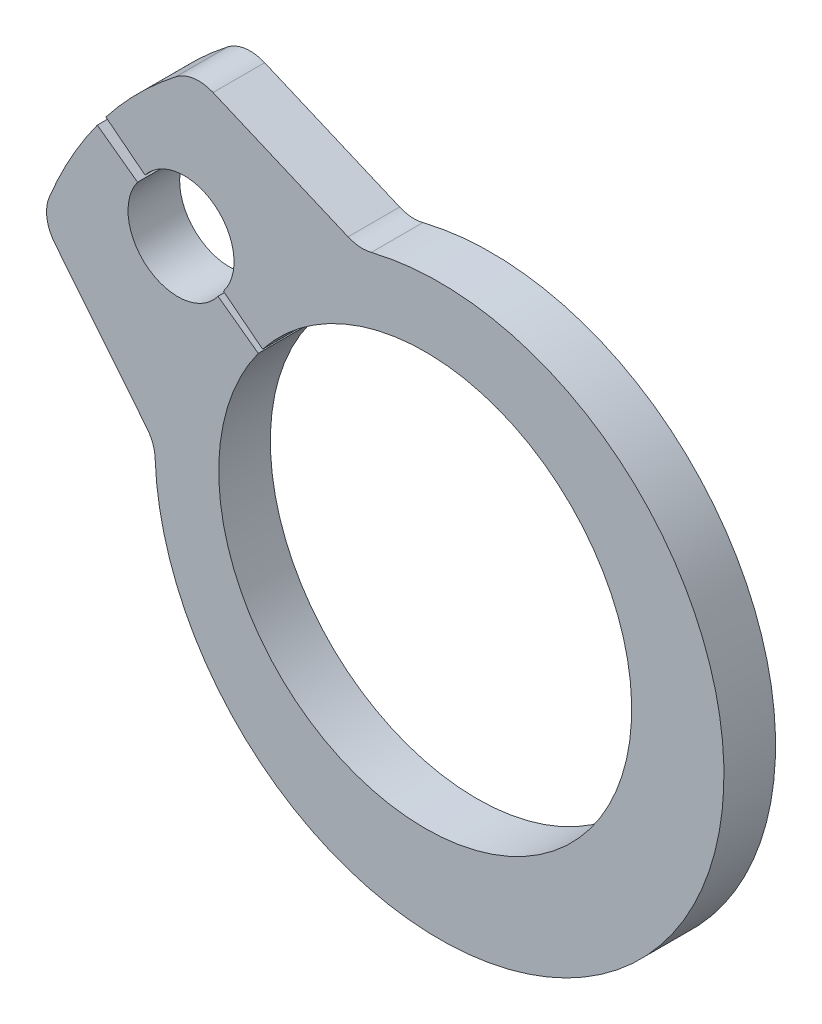
ISO-10303-21;
HEADER;
FILE_DESCRIPTION(('STEP AP214'),'2;1');
FILE_NAME('part.step','',(''),(''),'','','');
FILE_SCHEMA(('AUTOMOTIVE_DESIGN { 1 0 10303 214 1 1 1 1 }'));
ENDSEC;
DATA;
#1=APPLICATION_CONTEXT('core data for automotive mechanical design processes');
#2=APPLICATION_PROTOCOL_DEFINITION('international standard','automotive_design',2000,#1);
#3=PRODUCT_CONTEXT('',#1,'mechanical');
#4=PRODUCT('Part','Part','',(#3));
#5=PRODUCT_RELATED_PRODUCT_CATEGORY('part','',(#4));
#6=PRODUCT_DEFINITION_FORMATION('','',#4);
#7=PRODUCT_DEFINITION_CONTEXT('part definition',#1,'design');
#8=PRODUCT_DEFINITION('design','',#6,#7);
#9=PRODUCT_DEFINITION_SHAPE('','',#8);
#10=(LENGTH_UNIT() NAMED_UNIT(*) SI_UNIT(.MILLI.,.METRE.));
#11=(NAMED_UNIT(*) PLANE_ANGLE_UNIT() SI_UNIT($,.RADIAN.));
#12=(NAMED_UNIT(*) SI_UNIT($,.STERADIAN.) SOLID_ANGLE_UNIT());
#13=UNCERTAINTY_MEASURE_WITH_UNIT(LENGTH_MEASURE(1.E-05),#10,'distance_accuracy_value','');
#14=(GEOMETRIC_REPRESENTATION_CONTEXT(3) GLOBAL_UNCERTAINTY_ASSIGNED_CONTEXT((#13)) GLOBAL_UNIT_ASSIGNED_CONTEXT((#10,
#11,#12)) REPRESENTATION_CONTEXT('',''));
#15=CARTESIAN_POINT('',(0.,0.,0.));
#16=DIRECTION('',(0.,0.,1.));
#17=DIRECTION('',(1.,0.,0.));
#18=AXIS2_PLACEMENT_3D('',#15,#16,#17);
#19=CARTESIAN_POINT('',(0.,0.,-108.2));
#20=DIRECTION('',(0.,0.,-1.));
#21=DIRECTION('',(-1.,0.,0.));
#22=AXIS2_PLACEMENT_3D('',#19,#20,#21);
#23=PLANE('',#22);
#24=CARTESIAN_POINT('',(-3.26762624136908,2.55834296893836,-108.2));
#25=DIRECTION('',(0.,0.,1.));
#26=DIRECTION('',(1.,0.,0.));
#27=AXIS2_PLACEMENT_3D('',#24,#25,#26);
#28=CIRCLE('',#27,0.675);
#29=CARTESIAN_POINT('',(-2.73614486476086,2.14222694387007,-108.2));
#30=VERTEX_POINT('',#29);
#31=CARTESIAN_POINT('',(-3.7991076179773,2.97445899400665,-108.2));
#32=VERTEX_POINT('',#31);
#33=EDGE_CURVE('E203',#30,#32,#28,.T.);
#34=ORIENTED_EDGE('',*,*,#33,.T.);
#35=DIRECTION('',(-0.787379817197362,0.616468185286352,0.));
#36=VECTOR('',#35,1.);
#37=CARTESIAN_POINT('',(-3.7991076179773,2.97445899400665,-108.2));
#38=LINE('',#37,#36);
#39=CARTESIAN_POINT('',(-4.33058899458552,3.39057501907494,-108.2));
#40=VERTEX_POINT('',#39);
#41=EDGE_CURVE('E147',#32,#40,#38,.T.);
#42=ORIENTED_EDGE('',*,*,#41,.T.);
#43=CARTESIAN_POINT('',(-1.02288119785589E-13,0.,-108.2));
#44=DIRECTION('',(0.,0.,1.));
#45=DIRECTION('',(1.,0.,0.));
#46=AXIS2_PLACEMENT_3D('',#43,#44,#45);
#47=CIRCLE('',#46,5.4999999999999);
#48=CARTESIAN_POINT('',(-3.3800013366983,4.33884673201507,-108.2));
#49=VERTEX_POINT('',#48);
#50=EDGE_CURVE('E150',#49,#40,#47,.T.);
#51=ORIENTED_EDGE('',*,*,#50,.F.);
#52=CARTESIAN_POINT('',(-3.07272848790755,3.9444061200137,-108.2));
#53=DIRECTION('',(0.,0.,1.));
#54=DIRECTION('',(1.,0.,0.));
#55=AXIS2_PLACEMENT_3D('',#52,#53,#54);
#56=CIRCLE('',#55,0.5);
#57=CARTESIAN_POINT('',(-2.87689166349073,4.4044582238045,-108.2));
#58=VERTEX_POINT('',#57);
#59=EDGE_CURVE('E140',#58,#49,#56,.T.);
#60=ORIENTED_EDGE('',*,*,#59,.F.);
#61=DIRECTION('',(0.920104207581594,-0.391673648833626,0.));
#62=VECTOR('',#61,1.);
#63=CARTESIAN_POINT('',(-3.13920941911454,4.51612269795039,-108.2));
#64=LINE('',#63,#62);
#65=CARTESIAN_POINT('',(-1.0463324049971,3.62521841784285,-108.2));
#66=VERTEX_POINT('',#65);
#67=EDGE_CURVE('E136',#58,#66,#64,.T.);
#68=ORIENTED_EDGE('',*,*,#67,.T.);
#69=CARTESIAN_POINT('',(-0.850495580580285,4.08527052163364,-108.2));
#70=DIRECTION('',(0.,0.,1.));
#71=DIRECTION('',(1.,0.,0.));
#72=AXIS2_PLACEMENT_3D('',#69,#70,#71);
#73=CIRCLE('',#72,0.5);
#74=CARTESIAN_POINT('',(-0.730754082305288,3.59982024241768,-108.2));
#75=VERTEX_POINT('',#74);
#76=EDGE_CURVE('E20',#66,#75,#73,.T.);
#77=ORIENTED_EDGE('',*,*,#76,.T.);
#78=CARTESIAN_POINT('',(0.193159596736714,-0.145866590666214,-108.2));
#79=DIRECTION('',(0.,0.,1.));
#80=DIRECTION('',(1.,0.,0.));
#81=AXIS2_PLACEMENT_3D('',#78,#79,#80);
#82=CIRCLE('',#81,3.85795105436279);
#83=CARTESIAN_POINT('',(-3.66237834173939,-0.282298049026706,-108.2));
#84=VERTEX_POINT('',#83);
#85=EDGE_CURVE('E216',#84,#75,#82,.T.);
#86=ORIENTED_EDGE('',*,*,#85,.F.);
#87=CARTESIAN_POINT('',(-4.16206559595119,-0.29997990351864,-108.2));
#88=DIRECTION('',(0.,0.,1.));
#89=DIRECTION('',(1.,0.,0.));
#90=AXIS2_PLACEMENT_3D('',#87,#88,#89);
#91=CIRCLE('',#90,0.5);
#92=CARTESIAN_POINT('',(-3.77317056310963,0.0142821741031435,-108.2));
#93=VERTEX_POINT('',#92);
#94=EDGE_CURVE('E214',#84,#93,#91,.T.);
#95=ORIENTED_EDGE('',*,*,#94,.T.);
#96=DIRECTION('',(-0.628524155243566,0.777790065683126,0.));
#97=VECTOR('',#96,1.);
#98=CARTESIAN_POINT('',(-5.20281706019968,1.7834502062282,-108.2));
#99=LINE('',#98,#97);
#100=CARTESIAN_POINT('',(-5.02362752449243,1.56170560089404,-108.2));
#101=VERTEX_POINT('',#100);
#102=EDGE_CURVE('E166',#93,#101,#99,.T.);
#103=ORIENTED_EDGE('',*,*,#102,.T.);
#104=CARTESIAN_POINT('',(-4.63473249165086,1.87596767851582,-108.2));
#105=DIRECTION('',(0.,0.,1.));
#106=DIRECTION('',(1.,0.,0.));
#107=AXIS2_PLACEMENT_3D('',#104,#105,#106);
#108=CIRCLE('',#107,0.5);
#109=CARTESIAN_POINT('',(-5.09820574081595,2.0635644463674,-108.2));
#110=VERTEX_POINT('',#109);
#111=EDGE_CURVE('E169',#110,#101,#108,.T.);
#112=ORIENTED_EDGE('',*,*,#111,.F.);
#113=CARTESIAN_POINT('',(0.,0.,-108.2));
#114=DIRECTION('',(0.,0.,1.));
#115=DIRECTION('',(1.,0.,0.));
#116=AXIS2_PLACEMENT_3D('',#113,#114,#115);
#117=CIRCLE('',#116,5.5);
#118=CARTESIAN_POINT('',(-4.44628027847641,3.23737419604716,-108.2));
#119=VERTEX_POINT('',#118);
#120=EDGE_CURVE('E209',#119,#110,#117,.T.);
#121=ORIENTED_EDGE('',*,*,#120,.F.);
#122=DIRECTION('',(0.808414596086614,-0.588613490190393,0.));
#123=VECTOR('',#122,1.);
#124=CARTESIAN_POINT('',(-3.90060042611794,2.84006009016865,-108.2));
#125=LINE('',#124,#123);
#126=CARTESIAN_POINT('',(-3.90060042611794,2.84006009016865,-108.2));
#127=VERTEX_POINT('',#126);
#128=EDGE_CURVE('E162',#119,#127,#125,.T.);
#129=ORIENTED_EDGE('',*,*,#128,.T.);
#130=CARTESIAN_POINT('',(-3.35492057375948,2.44274598429013,-108.2));
#131=DIRECTION('',(0.,0.,1.));
#132=DIRECTION('',(1.,0.,0.));
#133=AXIS2_PLACEMENT_3D('',#130,#131,#132);
#134=CIRCLE('',#133,0.675);
#135=CARTESIAN_POINT('',(-2.80924072140101,2.04543187841162,-108.2));
#136=VERTEX_POINT('',#135);
#137=EDGE_CURVE('E207',#127,#136,#134,.T.);
#138=ORIENTED_EDGE('',*,*,#137,.T.);
#139=DIRECTION('',(0.808414596086614,-0.588613490190394,0.));
#140=VECTOR('',#139,1.);
#141=CARTESIAN_POINT('',(-2.26356086904255,1.6481177725331,-108.2));
#142=LINE('',#141,#140);
#143=CARTESIAN_POINT('',(-2.26356086904255,1.6481177725331,-108.2));
#144=VERTEX_POINT('',#143);
#145=EDGE_CURVE('E157',#136,#144,#142,.T.);
#146=ORIENTED_EDGE('',*,*,#145,.T.);
#147=CARTESIAN_POINT('',(0.,0.,-108.2));
#148=DIRECTION('',(0.,0.,1.));
#149=DIRECTION('',(1.,0.,0.));
#150=AXIS2_PLACEMENT_3D('',#147,#148,#149);
#151=CIRCLE('',#150,2.8);
#152=CARTESIAN_POINT('',(-2.20466348815264,1.72611091880179,-108.2));
#153=VERTEX_POINT('',#152);
#154=EDGE_CURVE('E205',#144,#153,#151,.T.);
#155=ORIENTED_EDGE('',*,*,#154,.T.);
#156=DIRECTION('',(-0.787379817197362,0.616468185286352,0.));
#157=VECTOR('',#156,1.);
#158=CARTESIAN_POINT('',(-2.73614486476086,2.14222694387007,-108.2));
#159=LINE('',#158,#157);
#160=EDGE_CURVE('E152',#153,#30,#159,.T.);
#161=ORIENTED_EDGE('',*,*,#160,.T.);
#162=EDGE_LOOP('',(#34,#42,#51,#60,#68,#77,#86,#95,#103,#112,#121,#129,#138,#146,#155,#161));
#163=FACE_BOUND('',#162,.T.);
#164=ADVANCED_FACE('F17',(#163),#23,.T.);
#165=CARTESIAN_POINT('',(-0.850495580580285,4.08527052163364,-108.2));
#166=DIRECTION('',(0.,0.,1.));
#167=DIRECTION('',(1.,0.,0.));
#168=AXIS2_PLACEMENT_3D('',#165,#166,#167);
#169=CYLINDRICAL_SURFACE('',#168,0.5);
#170=DIRECTION('',(0.,0.,1.));
#171=VECTOR('',#170,1.);
#172=CARTESIAN_POINT('',(-1.0463324049971,3.62521841784285,-108.2));
#173=LINE('',#172,#171);
#174=CARTESIAN_POINT('',(-1.0463324049971,3.62521841784285,-107.5));
#175=VERTEX_POINT('',#174);
#176=EDGE_CURVE('E131',#66,#175,#173,.T.);
#177=ORIENTED_EDGE('',*,*,#176,.T.);
#178=CARTESIAN_POINT('',(-0.850495580580284,4.08527052163364,-107.5));
#179=DIRECTION('',(0.,0.,1.));
#180=DIRECTION('',(1.,0.,0.));
#181=AXIS2_PLACEMENT_3D('',#178,#179,#180);
#182=CIRCLE('',#181,0.5);
#183=CARTESIAN_POINT('',(-0.730754082305288,3.59982024241768,-107.5));
#184=VERTEX_POINT('',#183);
#185=EDGE_CURVE('E137',#175,#184,#182,.T.);
#186=ORIENTED_EDGE('',*,*,#185,.T.);
#187=DIRECTION('',(0.,0.,1.));
#188=VECTOR('',#187,1.);
#189=CARTESIAN_POINT('',(-0.730754082305288,3.59982024241768,-108.2));
#190=LINE('',#189,#188);
#191=EDGE_CURVE('E132',#75,#184,#190,.T.);
#192=ORIENTED_EDGE('',*,*,#191,.F.);
#193=ORIENTED_EDGE('',*,*,#76,.F.);
#194=EDGE_LOOP('',(#177,#186,#192,#193));
#195=FACE_BOUND('',#194,.T.);
#196=ADVANCED_FACE('F129',(#195),#169,.F.);
#197=CARTESIAN_POINT('',(0.193159596736714,-0.145866590666214,-108.2));
#198=DIRECTION('',(0.,0.,1.));
#199=DIRECTION('',(1.,0.,0.));
#200=AXIS2_PLACEMENT_3D('',#197,#198,#199);
#201=CYLINDRICAL_SURFACE('',#200,3.85795105436279);
#202=CARTESIAN_POINT('',(0.193159596736714,-0.145866590666214,-107.5));
#203=DIRECTION('',(0.,0.,1.));
#204=DIRECTION('',(1.,0.,0.));
#205=AXIS2_PLACEMENT_3D('',#202,#203,#204);
#206=CIRCLE('',#205,3.85795105436279);
#207=CARTESIAN_POINT('',(-3.66237834173939,-0.282298049026706,-107.5));
#208=VERTEX_POINT('',#207);
#209=EDGE_CURVE('E197',#184,#208,#206,.F.);
#210=ORIENTED_EDGE('',*,*,#209,.T.);
#211=DIRECTION('',(0.,0.,1.));
#212=VECTOR('',#211,1.);
#213=CARTESIAN_POINT('',(-3.66237834173939,-0.282298049026706,-108.2));
#214=LINE('',#213,#212);
#215=EDGE_CURVE('E215',#208,#84,#214,.F.);
#216=ORIENTED_EDGE('',*,*,#215,.T.);
#217=ORIENTED_EDGE('',*,*,#85,.T.);
#218=ORIENTED_EDGE('',*,*,#191,.T.);
#219=EDGE_LOOP('',(#210,#216,#217,#218));
#220=FACE_BOUND('',#219,.T.);
#221=ADVANCED_FACE('F221',(#220),#201,.T.);
#222=CARTESIAN_POINT('',(-4.16206559595119,-0.29997990351864,-108.2));
#223=DIRECTION('',(0.,0.,1.));
#224=DIRECTION('',(1.,0.,0.));
#225=AXIS2_PLACEMENT_3D('',#222,#223,#224);
#226=CYLINDRICAL_SURFACE('',#225,0.5);
#227=ORIENTED_EDGE('',*,*,#215,.F.);
#228=CARTESIAN_POINT('',(-4.16206559595119,-0.29997990351864,-107.5));
#229=DIRECTION('',(0.,0.,1.));
#230=DIRECTION('',(1.,0.,0.));
#231=AXIS2_PLACEMENT_3D('',#228,#229,#230);
#232=CIRCLE('',#231,0.5);
#233=CARTESIAN_POINT('',(-3.77317056310963,0.0142821741031436,-107.5));
#234=VERTEX_POINT('',#233);
#235=EDGE_CURVE('E194',#208,#234,#232,.T.);
#236=ORIENTED_EDGE('',*,*,#235,.T.);
#237=DIRECTION('',(0.,0.,1.));
#238=VECTOR('',#237,1.);
#239=CARTESIAN_POINT('',(-3.77317056310963,0.0142821741031436,-108.2));
#240=LINE('',#239,#238);
#241=EDGE_CURVE('E170',#234,#93,#240,.F.);
#242=ORIENTED_EDGE('',*,*,#241,.T.);
#243=ORIENTED_EDGE('',*,*,#94,.F.);
#244=EDGE_LOOP('',(#227,#236,#242,#243));
#245=FACE_BOUND('',#244,.T.);
#246=ADVANCED_FACE('F232',(#245),#226,.F.);
#247=CARTESIAN_POINT('',(-5.20281706019968,1.7834502062282,-108.2));
#248=DIRECTION('',(0.777790065683126,0.628524155243566,0.));
#249=DIRECTION('',(-0.628524155243566,0.777790065683126,0.));
#250=AXIS2_PLACEMENT_3D('',#247,#248,#249);
#251=PLANE('',#250);
#252=DIRECTION('',(0.,0.,1.));
#253=VECTOR('',#252,1.);
#254=CARTESIAN_POINT('',(-5.02362752449243,1.56170560089404,-108.2));
#255=LINE('',#254,#253);
#256=CARTESIAN_POINT('',(-5.02362752449243,1.56170560089404,-107.5));
#257=VERTEX_POINT('',#256);
#258=EDGE_CURVE('E212',#101,#257,#255,.T.);
#259=ORIENTED_EDGE('',*,*,#258,.F.);
#260=ORIENTED_EDGE('',*,*,#102,.F.);
#261=ORIENTED_EDGE('',*,*,#241,.F.);
#262=DIRECTION('',(-0.628524155243566,0.777790065683126,0.));
#263=VECTOR('',#262,1.);
#264=CARTESIAN_POINT('',(-3.77317056310963,0.0142821741031436,-107.5));
#265=LINE('',#264,#263);
#266=EDGE_CURVE('E193',#234,#257,#265,.T.);
#267=ORIENTED_EDGE('',*,*,#266,.T.);
#268=EDGE_LOOP('',(#259,#260,#261,#267));
#269=FACE_BOUND('',#268,.T.);
#270=ADVANCED_FACE('F238',(#269),#251,.F.);
#271=CARTESIAN_POINT('',(-4.63473249165086,1.87596767851582,-108.2));
#272=DIRECTION('',(0.,0.,1.));
#273=DIRECTION('',(1.,0.,0.));
#274=AXIS2_PLACEMENT_3D('',#271,#272,#273);
#275=CYLINDRICAL_SURFACE('',#274,0.5);
#276=CARTESIAN_POINT('',(-4.63473249165086,1.87596767851582,-107.5));
#277=DIRECTION('',(0.,0.,1.));
#278=DIRECTION('',(1.,0.,0.));
#279=AXIS2_PLACEMENT_3D('',#276,#277,#278);
#280=CIRCLE('',#279,0.5);
#281=CARTESIAN_POINT('',(-5.09820574081595,2.0635644463674,-107.5));
#282=VERTEX_POINT('',#281);
#283=EDGE_CURVE('E190',#257,#282,#280,.F.);
#284=ORIENTED_EDGE('',*,*,#283,.T.);
#285=DIRECTION('',(0.,0.,1.));
#286=VECTOR('',#285,1.);
#287=CARTESIAN_POINT('',(-5.09820574081595,2.0635644463674,-108.2));
#288=LINE('',#287,#286);
#289=EDGE_CURVE('E211',#110,#282,#288,.T.);
#290=ORIENTED_EDGE('',*,*,#289,.F.);
#291=ORIENTED_EDGE('',*,*,#111,.T.);
#292=ORIENTED_EDGE('',*,*,#258,.T.);
#293=EDGE_LOOP('',(#284,#290,#291,#292));
#294=FACE_BOUND('',#293,.T.);
#295=ADVANCED_FACE('F304',(#294),#275,.T.);
#296=CARTESIAN_POINT('',(0.,0.,-108.2));
#297=DIRECTION('',(0.,0.,1.));
#298=DIRECTION('',(1.,0.,0.));
#299=AXIS2_PLACEMENT_3D('',#296,#297,#298);
#300=CYLINDRICAL_SURFACE('',#299,5.5);
#301=CARTESIAN_POINT('',(0.,0.,-107.5));
#302=DIRECTION('',(0.,0.,1.));
#303=DIRECTION('',(1.,0.,0.));
#304=AXIS2_PLACEMENT_3D('',#301,#302,#303);
#305=CIRCLE('',#304,5.5);
#306=CARTESIAN_POINT('',(-4.44628027847641,3.23737419604716,-107.5));
#307=VERTEX_POINT('',#306);
#308=EDGE_CURVE('E187',#282,#307,#305,.F.);
#309=ORIENTED_EDGE('',*,*,#308,.T.);
#310=DIRECTION('',(0.,0.,1.));
#311=VECTOR('',#310,1.);
#312=CARTESIAN_POINT('',(-4.44628027847641,3.23737419604716,-108.2));
#313=LINE('',#312,#311);
#314=EDGE_CURVE('E165',#307,#119,#313,.F.);
#315=ORIENTED_EDGE('',*,*,#314,.T.);
#316=ORIENTED_EDGE('',*,*,#120,.T.);
#317=ORIENTED_EDGE('',*,*,#289,.T.);
#318=EDGE_LOOP('',(#309,#315,#316,#317));
#319=FACE_BOUND('',#318,.T.);
#320=ADVANCED_FACE('F302',(#319),#300,.T.);
#321=CARTESIAN_POINT('',(-3.90060042611794,2.84006009016865,-108.2));
#322=DIRECTION('',(-0.588613490190393,-0.808414596086614,0.));
#323=DIRECTION('',(0.808414596086614,-0.588613490190393,0.));
#324=AXIS2_PLACEMENT_3D('',#321,#322,#323);
#325=PLANE('',#324);
#326=DIRECTION('',(0.,0.,1.));
#327=VECTOR('',#326,1.);
#328=CARTESIAN_POINT('',(-3.90060042611794,2.84006009016865,-108.2));
#329=LINE('',#328,#327);
#330=CARTESIAN_POINT('',(-3.90060042611794,2.84006009016865,-107.5));
#331=VERTEX_POINT('',#330);
#332=EDGE_CURVE('E164',#331,#127,#329,.F.);
#333=ORIENTED_EDGE('',*,*,#332,.T.);
#334=ORIENTED_EDGE('',*,*,#128,.F.);
#335=ORIENTED_EDGE('',*,*,#314,.F.);
#336=DIRECTION('',(0.808414596086614,-0.588613490190393,0.));
#337=VECTOR('',#336,1.);
#338=CARTESIAN_POINT('',(-4.44628027847641,3.23737419604716,-107.5));
#339=LINE('',#338,#337);
#340=EDGE_CURVE('E186',#307,#331,#339,.T.);
#341=ORIENTED_EDGE('',*,*,#340,.T.);
#342=EDGE_LOOP('',(#333,#334,#335,#341));
#343=FACE_BOUND('',#342,.T.);
#344=ADVANCED_FACE('F299',(#343),#325,.F.);
#345=CARTESIAN_POINT('',(-3.35492057375948,2.44274598429013,-108.2));
#346=DIRECTION('',(0.,0.,1.));
#347=DIRECTION('',(1.,0.,0.));
#348=AXIS2_PLACEMENT_3D('',#345,#346,#347);
#349=CYLINDRICAL_SURFACE('',#348,0.675);
#350=DIRECTION('',(0.,0.,1.));
#351=VECTOR('',#350,1.);
#352=CARTESIAN_POINT('',(-2.80924072140101,2.04543187841162,-108.2));
#353=LINE('',#352,#351);
#354=CARTESIAN_POINT('',(-2.80924072140101,2.04543187841162,-107.5));
#355=VERTEX_POINT('',#354);
#356=EDGE_CURVE('E161',#355,#136,#353,.F.);
#357=ORIENTED_EDGE('',*,*,#356,.T.);
#358=ORIENTED_EDGE('',*,*,#137,.F.);
#359=ORIENTED_EDGE('',*,*,#332,.F.);
#360=CARTESIAN_POINT('',(-3.35492057375948,2.44274598429013,-107.5));
#361=DIRECTION('',(0.,0.,1.));
#362=DIRECTION('',(1.,0.,0.));
#363=AXIS2_PLACEMENT_3D('',#360,#361,#362);
#364=CIRCLE('',#363,0.675);
#365=EDGE_CURVE('E183',#331,#355,#364,.T.);
#366=ORIENTED_EDGE('',*,*,#365,.T.);
#367=EDGE_LOOP('',(#357,#358,#359,#366));
#368=FACE_BOUND('',#367,.T.);
#369=ADVANCED_FACE('F295',(#368),#349,.F.);
#370=CARTESIAN_POINT('',(-2.26356086904255,1.6481177725331,-108.2));
#371=DIRECTION('',(-0.588613490190394,-0.808414596086614,0.));
#372=DIRECTION('',(0.808414596086614,-0.588613490190394,0.));
#373=AXIS2_PLACEMENT_3D('',#370,#371,#372);
#374=PLANE('',#373);
#375=DIRECTION('',(0.,0.,1.));
#376=VECTOR('',#375,1.);
#377=CARTESIAN_POINT('',(-2.26356086904255,1.6481177725331,-108.2));
#378=LINE('',#377,#376);
#379=CARTESIAN_POINT('',(-2.26356086904255,1.6481177725331,-107.5));
#380=VERTEX_POINT('',#379);
#381=EDGE_CURVE('E160',#380,#144,#378,.F.);
#382=ORIENTED_EDGE('',*,*,#381,.T.);
#383=ORIENTED_EDGE('',*,*,#145,.F.);
#384=ORIENTED_EDGE('',*,*,#356,.F.);
#385=DIRECTION('',(0.808414596086614,-0.588613490190393,0.));
#386=VECTOR('',#385,1.);
#387=CARTESIAN_POINT('',(-2.80924072140101,2.04543187841162,-107.5));
#388=LINE('',#387,#386);
#389=EDGE_CURVE('E182',#355,#380,#388,.T.);
#390=ORIENTED_EDGE('',*,*,#389,.T.);
#391=EDGE_LOOP('',(#382,#383,#384,#390));
#392=FACE_BOUND('',#391,.T.);
#393=ADVANCED_FACE('F291',(#392),#374,.F.);
#394=CARTESIAN_POINT('',(0.,0.,-108.2));
#395=DIRECTION('',(0.,0.,1.));
#396=DIRECTION('',(1.,0.,0.));
#397=AXIS2_PLACEMENT_3D('',#394,#395,#396);
#398=CYLINDRICAL_SURFACE('',#397,2.8);
#399=ORIENTED_EDGE('',*,*,#154,.F.);
#400=ORIENTED_EDGE('',*,*,#381,.F.);
#401=CARTESIAN_POINT('',(0.,0.,-107.5));
#402=DIRECTION('',(0.,0.,1.));
#403=DIRECTION('',(1.,0.,0.));
#404=AXIS2_PLACEMENT_3D('',#401,#402,#403);
#405=CIRCLE('',#404,2.8);
#406=CARTESIAN_POINT('',(-2.20466348815264,1.72611091880179,-107.5));
#407=VERTEX_POINT('',#406);
#408=EDGE_CURVE('E180',#380,#407,#405,.T.);
#409=ORIENTED_EDGE('',*,*,#408,.T.);
#410=DIRECTION('',(0.,0.,1.));
#411=VECTOR('',#410,1.);
#412=CARTESIAN_POINT('',(-2.20466348815264,1.72611091880178,-108.2));
#413=LINE('',#412,#411);
#414=EDGE_CURVE('E156',#407,#153,#413,.F.);
#415=ORIENTED_EDGE('',*,*,#414,.T.);
#416=EDGE_LOOP('',(#399,#400,#409,#415));
#417=FACE_BOUND('',#416,.T.);
#418=ADVANCED_FACE('F305',(#417),#398,.F.);
#419=CARTESIAN_POINT('',(-2.73614486476086,2.14222694387007,-108.2));
#420=DIRECTION('',(0.616468185286352,0.787379817197362,0.));
#421=DIRECTION('',(-0.787379817197362,0.616468185286352,0.));
#422=AXIS2_PLACEMENT_3D('',#419,#420,#421);
#423=PLANE('',#422);
#424=DIRECTION('',(0.,0.,1.));
#425=VECTOR('',#424,1.);
#426=CARTESIAN_POINT('',(-2.73614486476086,2.14222694387007,-108.2));
#427=LINE('',#426,#425);
#428=CARTESIAN_POINT('',(-2.73614486476086,2.14222694387007,-107.5));
#429=VERTEX_POINT('',#428);
#430=EDGE_CURVE('E155',#429,#30,#427,.F.);
#431=ORIENTED_EDGE('',*,*,#430,.T.);
#432=ORIENTED_EDGE('',*,*,#160,.F.);
#433=ORIENTED_EDGE('',*,*,#414,.F.);
#434=DIRECTION('',(-0.787379817197363,0.616468185286352,0.));
#435=VECTOR('',#434,1.);
#436=CARTESIAN_POINT('',(-2.20466348815264,1.72611091880179,-107.5));
#437=LINE('',#436,#435);
#438=EDGE_CURVE('E179',#407,#429,#437,.T.);
#439=ORIENTED_EDGE('',*,*,#438,.T.);
#440=EDGE_LOOP('',(#431,#432,#433,#439));
#441=FACE_BOUND('',#440,.T.);
#442=ADVANCED_FACE('F284',(#441),#423,.F.);
#443=CARTESIAN_POINT('',(-3.26762624136908,2.55834296893836,-108.2));
#444=DIRECTION('',(0.,0.,1.));
#445=DIRECTION('',(1.,0.,0.));
#446=AXIS2_PLACEMENT_3D('',#443,#444,#445);
#447=CYLINDRICAL_SURFACE('',#446,0.675);
#448=ORIENTED_EDGE('',*,*,#33,.F.);
#449=ORIENTED_EDGE('',*,*,#430,.F.);
#450=CARTESIAN_POINT('',(-3.26762624136908,2.55834296893836,-107.5));
#451=DIRECTION('',(0.,0.,1.));
#452=DIRECTION('',(1.,0.,0.));
#453=AXIS2_PLACEMENT_3D('',#450,#451,#452);
#454=CIRCLE('',#453,0.675);
#455=CARTESIAN_POINT('',(-3.7991076179773,2.97445899400665,-107.5));
#456=VERTEX_POINT('',#455);
#457=EDGE_CURVE('E177',#429,#456,#454,.T.);
#458=ORIENTED_EDGE('',*,*,#457,.T.);
#459=DIRECTION('',(0.,0.,1.));
#460=VECTOR('',#459,1.);
#461=CARTESIAN_POINT('',(-3.7991076179773,2.97445899400665,-108.2));
#462=LINE('',#461,#460);
#463=EDGE_CURVE('E151',#456,#32,#462,.F.);
#464=ORIENTED_EDGE('',*,*,#463,.T.);
#465=EDGE_LOOP('',(#448,#449,#458,#464));
#466=FACE_BOUND('',#465,.T.);
#467=ADVANCED_FACE('F281',(#466),#447,.F.);
#468=CARTESIAN_POINT('',(-3.7991076179773,2.97445899400665,-108.2));
#469=DIRECTION('',(0.616468185286352,0.787379817197362,0.));
#470=DIRECTION('',(-0.787379817197362,0.616468185286352,0.));
#471=AXIS2_PLACEMENT_3D('',#468,#469,#470);
#472=PLANE('',#471);
#473=DIRECTION('',(0.,0.,1.));
#474=VECTOR('',#473,1.);
#475=CARTESIAN_POINT('',(-4.33058899458552,3.39057501907493,-108.2));
#476=LINE('',#475,#474);
#477=CARTESIAN_POINT('',(-4.33058899458552,3.39057501907494,-107.5));
#478=VERTEX_POINT('',#477);
#479=EDGE_CURVE('E201',#40,#478,#476,.T.);
#480=ORIENTED_EDGE('',*,*,#479,.F.);
#481=ORIENTED_EDGE('',*,*,#41,.F.);
#482=ORIENTED_EDGE('',*,*,#463,.F.);
#483=DIRECTION('',(-0.787379817197362,0.616468185286353,0.));
#484=VECTOR('',#483,1.);
#485=CARTESIAN_POINT('',(-3.7991076179773,2.97445899400665,-107.5));
#486=LINE('',#485,#484);
#487=EDGE_CURVE('E176',#456,#478,#486,.T.);
#488=ORIENTED_EDGE('',*,*,#487,.T.);
#489=EDGE_LOOP('',(#480,#481,#482,#488));
#490=FACE_BOUND('',#489,.T.);
#491=ADVANCED_FACE('F272',(#490),#472,.F.);
#492=CARTESIAN_POINT('',(-1.02288119785589E-13,0.,-108.2));
#493=DIRECTION('',(0.,0.,1.));
#494=DIRECTION('',(1.,0.,0.));
#495=AXIS2_PLACEMENT_3D('',#492,#493,#494);
#496=CYLINDRICAL_SURFACE('',#495,5.4999999999999);
#497=ORIENTED_EDGE('',*,*,#50,.T.);
#498=ORIENTED_EDGE('',*,*,#479,.T.);
#499=CARTESIAN_POINT('',(-1.02059616925534E-13,0.,-107.5));
#500=DIRECTION('',(0.,0.,1.));
#501=DIRECTION('',(1.,0.,0.));
#502=AXIS2_PLACEMENT_3D('',#499,#500,#501);
#503=CIRCLE('',#502,5.4999999999999);
#504=CARTESIAN_POINT('',(-3.3800013366983,4.33884673201507,-107.5));
#505=VERTEX_POINT('',#504);
#506=EDGE_CURVE('E173',#478,#505,#503,.F.);
#507=ORIENTED_EDGE('',*,*,#506,.T.);
#508=DIRECTION('',(0.,0.,1.));
#509=VECTOR('',#508,1.);
#510=CARTESIAN_POINT('',(-3.3800013366983,4.33884673201507,-108.2));
#511=LINE('',#510,#509);
#512=EDGE_CURVE('E142',#49,#505,#511,.T.);
#513=ORIENTED_EDGE('',*,*,#512,.F.);
#514=EDGE_LOOP('',(#497,#498,#507,#513));
#515=FACE_BOUND('',#514,.T.);
#516=ADVANCED_FACE('F279',(#515),#496,.T.);
#517=CARTESIAN_POINT('',(-3.07272848790755,3.9444061200137,-108.2));
#518=DIRECTION('',(0.,0.,1.));
#519=DIRECTION('',(1.,0.,0.));
#520=AXIS2_PLACEMENT_3D('',#517,#518,#519);
#521=CYLINDRICAL_SURFACE('',#520,0.5);
#522=CARTESIAN_POINT('',(-3.07272848790755,3.9444061200137,-107.5));
#523=DIRECTION('',(0.,0.,1.));
#524=DIRECTION('',(1.,0.,0.));
#525=AXIS2_PLACEMENT_3D('',#522,#523,#524);
#526=CIRCLE('',#525,0.5);
#527=CARTESIAN_POINT('',(-2.87689166349073,4.4044582238045,-107.5));
#528=VERTEX_POINT('',#527);
#529=EDGE_CURVE('E26',#505,#528,#526,.F.);
#530=ORIENTED_EDGE('',*,*,#529,.T.);
#531=DIRECTION('',(0.,0.,1.));
#532=VECTOR('',#531,1.);
#533=CARTESIAN_POINT('',(-2.87689166349073,4.4044582238045,-108.2));
#534=LINE('',#533,#532);
#535=EDGE_CURVE('E34',#528,#58,#534,.F.);
#536=ORIENTED_EDGE('',*,*,#535,.T.);
#537=ORIENTED_EDGE('',*,*,#59,.T.);
#538=ORIENTED_EDGE('',*,*,#512,.T.);
#539=EDGE_LOOP('',(#530,#536,#537,#538));
#540=FACE_BOUND('',#539,.T.);
#541=ADVANCED_FACE('F320',(#540),#521,.T.);
#542=CARTESIAN_POINT('',(-3.13920941911454,4.51612269795039,-108.2));
#543=DIRECTION('',(-0.391673648833626,-0.920104207581594,0.));
#544=DIRECTION('',(0.920104207581594,-0.391673648833626,0.));
#545=AXIS2_PLACEMENT_3D('',#542,#543,#544);
#546=PLANE('',#545);
#547=ORIENTED_EDGE('',*,*,#176,.F.);
#548=ORIENTED_EDGE('',*,*,#67,.F.);
#549=ORIENTED_EDGE('',*,*,#535,.F.);
#550=DIRECTION('',(0.920104207581594,-0.391673648833626,0.));
#551=VECTOR('',#550,1.);
#552=CARTESIAN_POINT('',(-2.87689166349073,4.4044582238045,-107.5));
#553=LINE('',#552,#551);
#554=EDGE_CURVE('E11',#528,#175,#553,.T.);
#555=ORIENTED_EDGE('',*,*,#554,.T.);
#556=EDGE_LOOP('',(#547,#548,#549,#555));
#557=FACE_BOUND('',#556,.T.);
#558=ADVANCED_FACE('F135',(#557),#546,.F.);
#559=CARTESIAN_POINT('',(0.,0.,-107.5));
#560=DIRECTION('',(0.,0.,-1.));
#561=DIRECTION('',(-1.,0.,0.));
#562=AXIS2_PLACEMENT_3D('',#559,#560,#561);
#563=PLANE('',#562);
#564=ORIENTED_EDGE('',*,*,#529,.F.);
#565=ORIENTED_EDGE('',*,*,#506,.F.);
#566=ORIENTED_EDGE('',*,*,#487,.F.);
#567=ORIENTED_EDGE('',*,*,#457,.F.);
#568=ORIENTED_EDGE('',*,*,#438,.F.);
#569=ORIENTED_EDGE('',*,*,#408,.F.);
#570=ORIENTED_EDGE('',*,*,#389,.F.);
#571=ORIENTED_EDGE('',*,*,#365,.F.);
#572=ORIENTED_EDGE('',*,*,#340,.F.);
#573=ORIENTED_EDGE('',*,*,#308,.F.);
#574=ORIENTED_EDGE('',*,*,#283,.F.);
#575=ORIENTED_EDGE('',*,*,#266,.F.);
#576=ORIENTED_EDGE('',*,*,#235,.F.);
#577=ORIENTED_EDGE('',*,*,#209,.F.);
#578=ORIENTED_EDGE('',*,*,#185,.F.);
#579=ORIENTED_EDGE('',*,*,#554,.F.);
#580=EDGE_LOOP('',(#564,#565,#566,#567,#568,#569,#570,#571,#572,#573,#574,#575,#576,#577,#578,#579));
#581=FACE_BOUND('',#580,.T.);
#582=ADVANCED_FACE('F226',(#581),#563,.F.);
#583=CLOSED_SHELL('',(#164,#196,#221,#246,#270,#295,#320,#344,#369,#393,#418,#442,#467,#491,
#516,#541,#558,#582));
#584=MANIFOLD_SOLID_BREP('B1',#583);
#585=ADVANCED_BREP_SHAPE_REPRESENTATION('',(#18,#584),#14);
#586=SHAPE_DEFINITION_REPRESENTATION(#9,#585);
ENDSEC;
END-ISO-10303-21;
